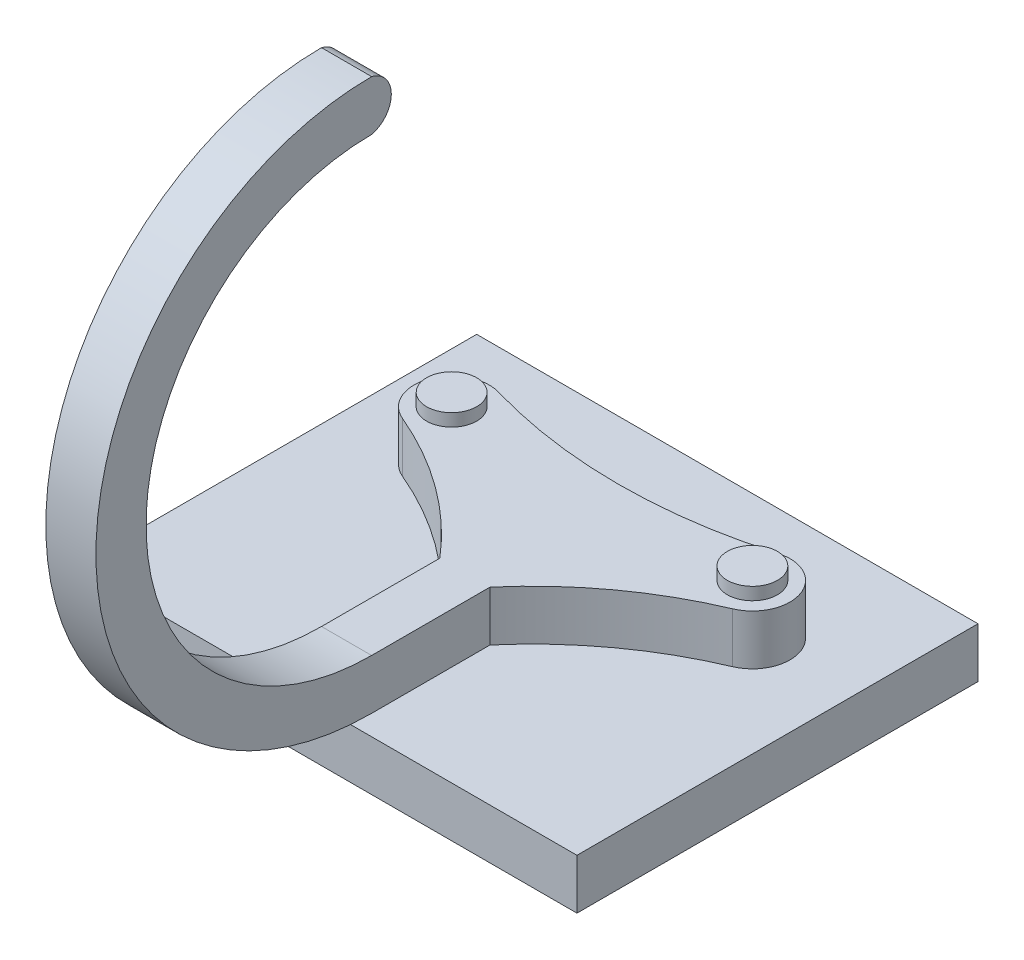
ISO-10303-21;
HEADER;
FILE_DESCRIPTION(('STEP AP214'),'2;1');
FILE_NAME('part.step','',(''),(''),'','','');
FILE_SCHEMA(('AUTOMOTIVE_DESIGN { 1 0 10303 214 1 1 1 1 }'));
ENDSEC;
DATA;
#1=APPLICATION_CONTEXT('core data for automotive mechanical design processes');
#2=APPLICATION_PROTOCOL_DEFINITION('international standard','automotive_design',2000,#1);
#3=PRODUCT_CONTEXT('',#1,'mechanical');
#4=PRODUCT('Part','Part','',(#3));
#5=PRODUCT_RELATED_PRODUCT_CATEGORY('part','',(#4));
#6=PRODUCT_DEFINITION_FORMATION('','',#4);
#7=PRODUCT_DEFINITION_CONTEXT('part definition',#1,'design');
#8=PRODUCT_DEFINITION('design','',#6,#7);
#9=PRODUCT_DEFINITION_SHAPE('','',#8);
#10=(LENGTH_UNIT() NAMED_UNIT(*) SI_UNIT(.MILLI.,.METRE.));
#11=(NAMED_UNIT(*) PLANE_ANGLE_UNIT() SI_UNIT($,.RADIAN.));
#12=(NAMED_UNIT(*) SI_UNIT($,.STERADIAN.) SOLID_ANGLE_UNIT());
#13=UNCERTAINTY_MEASURE_WITH_UNIT(LENGTH_MEASURE(1.E-05),#10,'distance_accuracy_value','');
#14=(GEOMETRIC_REPRESENTATION_CONTEXT(3) GLOBAL_UNCERTAINTY_ASSIGNED_CONTEXT((#13)) GLOBAL_UNIT_ASSIGNED_CONTEXT((#10,
#11,#12)) REPRESENTATION_CONTEXT('',''));
#15=CARTESIAN_POINT('',(0.,0.,0.));
#16=DIRECTION('',(0.,0.,1.));
#17=DIRECTION('',(1.,0.,0.));
#18=AXIS2_PLACEMENT_3D('',#15,#16,#17);
#19=CARTESIAN_POINT('',(10.,2.,-8.));
#20=DIRECTION('',(-1.,0.,0.));
#21=DIRECTION('',(0.,0.,1.));
#22=AXIS2_PLACEMENT_3D('',#19,#20,#21);
#23=PLANE('',#22);
#24=DIRECTION('',(0.,0.,-1.));
#25=VECTOR('',#24,1.);
#26=CARTESIAN_POINT('',(10.,0.,-8.));
#27=LINE('',#26,#25);
#28=CARTESIAN_POINT('',(10.,0.,8.));
#29=VERTEX_POINT('',#28);
#30=CARTESIAN_POINT('',(10.,0.,-8.));
#31=VERTEX_POINT('',#30);
#32=EDGE_CURVE('E254',#29,#31,#27,.T.);
#33=ORIENTED_EDGE('',*,*,#32,.T.);
#34=DIRECTION('',(0.,-1.,0.));
#35=VECTOR('',#34,1.);
#36=CARTESIAN_POINT('',(10.,2.,-8.));
#37=LINE('',#36,#35);
#38=CARTESIAN_POINT('',(10.,2.,-8.));
#39=VERTEX_POINT('',#38);
#40=EDGE_CURVE('E11',#39,#31,#37,.T.);
#41=ORIENTED_EDGE('',*,*,#40,.F.);
#42=DIRECTION('',(0.,0.,-1.));
#43=VECTOR('',#42,1.);
#44=CARTESIAN_POINT('',(10.,2.,-8.));
#45=LINE('',#44,#43);
#46=CARTESIAN_POINT('',(10.,2.,8.));
#47=VERTEX_POINT('',#46);
#48=EDGE_CURVE('E255',#47,#39,#45,.T.);
#49=ORIENTED_EDGE('',*,*,#48,.F.);
#50=DIRECTION('',(0.,-1.,0.));
#51=VECTOR('',#50,1.);
#52=CARTESIAN_POINT('',(10.,2.,8.));
#53=LINE('',#52,#51);
#54=EDGE_CURVE('E269',#47,#29,#53,.T.);
#55=ORIENTED_EDGE('',*,*,#54,.T.);
#56=EDGE_LOOP('',(#33,#41,#49,#55));
#57=FACE_BOUND('',#56,.T.);
#58=ADVANCED_FACE('F39',(#57),#23,.F.);
#59=CARTESIAN_POINT('',(-10.,2.,-8.));
#60=DIRECTION('',(0.,0.,1.));
#61=DIRECTION('',(1.,0.,0.));
#62=AXIS2_PLACEMENT_3D('',#59,#60,#61);
#63=PLANE('',#62);
#64=DIRECTION('',(-1.,0.,0.));
#65=VECTOR('',#64,1.);
#66=CARTESIAN_POINT('',(-10.,0.,-8.));
#67=LINE('',#66,#65);
#68=CARTESIAN_POINT('',(-10.,0.,-8.));
#69=VERTEX_POINT('',#68);
#70=EDGE_CURVE('E273',#31,#69,#67,.T.);
#71=ORIENTED_EDGE('',*,*,#70,.T.);
#72=DIRECTION('',(0.,-1.,0.));
#73=VECTOR('',#72,1.);
#74=CARTESIAN_POINT('',(-10.,2.,-8.));
#75=LINE('',#74,#73);
#76=CARTESIAN_POINT('',(-10.,2.,-8.));
#77=VERTEX_POINT('',#76);
#78=EDGE_CURVE('E47',#77,#69,#75,.T.);
#79=ORIENTED_EDGE('',*,*,#78,.F.);
#80=DIRECTION('',(-1.,0.,0.));
#81=VECTOR('',#80,1.);
#82=CARTESIAN_POINT('',(-10.,2.,-8.));
#83=LINE('',#82,#81);
#84=EDGE_CURVE('E259',#39,#77,#83,.T.);
#85=ORIENTED_EDGE('',*,*,#84,.F.);
#86=ORIENTED_EDGE('',*,*,#40,.T.);
#87=EDGE_LOOP('',(#71,#79,#85,#86));
#88=FACE_BOUND('',#87,.T.);
#89=ADVANCED_FACE('F309',(#88),#63,.F.);
#90=CARTESIAN_POINT('',(-10.,2.,-8.));
#91=DIRECTION('',(1.,0.,0.));
#92=DIRECTION('',(0.,0.,-1.));
#93=AXIS2_PLACEMENT_3D('',#90,#91,#92);
#94=PLANE('',#93);
#95=DIRECTION('',(0.,0.,1.));
#96=VECTOR('',#95,1.);
#97=CARTESIAN_POINT('',(-10.,0.,-8.));
#98=LINE('',#97,#96);
#99=CARTESIAN_POINT('',(-10.,0.,8.));
#100=VERTEX_POINT('',#99);
#101=EDGE_CURVE('E276',#69,#100,#98,.T.);
#102=ORIENTED_EDGE('',*,*,#101,.T.);
#103=DIRECTION('',(0.,-1.,0.));
#104=VECTOR('',#103,1.);
#105=CARTESIAN_POINT('',(-10.,2.,8.));
#106=LINE('',#105,#104);
#107=CARTESIAN_POINT('',(-10.,2.,8.));
#108=VERTEX_POINT('',#107);
#109=EDGE_CURVE('E284',#108,#100,#106,.T.);
#110=ORIENTED_EDGE('',*,*,#109,.F.);
#111=DIRECTION('',(0.,0.,1.));
#112=VECTOR('',#111,1.);
#113=CARTESIAN_POINT('',(-10.,2.,-8.));
#114=LINE('',#113,#112);
#115=EDGE_CURVE('E263',#77,#108,#114,.T.);
#116=ORIENTED_EDGE('',*,*,#115,.F.);
#117=ORIENTED_EDGE('',*,*,#78,.T.);
#118=EDGE_LOOP('',(#102,#110,#116,#117));
#119=FACE_BOUND('',#118,.T.);
#120=ADVANCED_FACE('F293',(#119),#94,.F.);
#121=CARTESIAN_POINT('',(-10.,2.,8.));
#122=DIRECTION('',(0.,0.,-1.));
#123=DIRECTION('',(-1.,0.,0.));
#124=AXIS2_PLACEMENT_3D('',#121,#122,#123);
#125=PLANE('',#124);
#126=DIRECTION('',(1.,0.,0.));
#127=VECTOR('',#126,1.);
#128=CARTESIAN_POINT('',(-10.,0.,8.));
#129=LINE('',#128,#127);
#130=EDGE_CURVE('E260',#100,#29,#129,.T.);
#131=ORIENTED_EDGE('',*,*,#130,.T.);
#132=ORIENTED_EDGE('',*,*,#54,.F.);
#133=DIRECTION('',(1.,0.,0.));
#134=VECTOR('',#133,1.);
#135=CARTESIAN_POINT('',(-10.,2.,8.));
#136=LINE('',#135,#134);
#137=EDGE_CURVE('E266',#108,#47,#136,.T.);
#138=ORIENTED_EDGE('',*,*,#137,.F.);
#139=ORIENTED_EDGE('',*,*,#109,.T.);
#140=EDGE_LOOP('',(#131,#132,#138,#139));
#141=FACE_BOUND('',#140,.T.);
#142=ADVANCED_FACE('F302',(#141),#125,.F.);
#143=CARTESIAN_POINT('',(0.,2.,0.));
#144=DIRECTION('',(0.,1.,0.));
#145=DIRECTION('',(0.,0.,1.));
#146=AXIS2_PLACEMENT_3D('',#143,#144,#145);
#147=PLANE('',#146);
#148=DIRECTION('',(1.,0.,0.));
#149=VECTOR('',#148,1.);
#150=CARTESIAN_POINT('',(-0.999999999999999,2.,7.19088318641341));
#151=LINE('',#150,#149);
#152=CARTESIAN_POINT('',(-1.,2.,7.19088318641342));
#153=VERTEX_POINT('',#152);
#154=CARTESIAN_POINT('',(1.,2.,7.19088318641341));
#155=VERTEX_POINT('',#154);
#156=EDGE_CURVE('E181',#153,#155,#151,.T.);
#157=ORIENTED_EDGE('',*,*,#156,.F.);
#158=DIRECTION('',(0.,0.,1.));
#159=VECTOR('',#158,1.);
#160=CARTESIAN_POINT('',(-0.999999999999999,2.,2.46982330561764));
#161=LINE('',#160,#159);
#162=CARTESIAN_POINT('',(-0.999999999999999,2.,2.46982330561764));
#163=VERTEX_POINT('',#162);
#164=EDGE_CURVE('E54',#163,#153,#161,.T.);
#165=ORIENTED_EDGE('',*,*,#164,.F.);
#166=CARTESIAN_POINT('',(-12.4139361558117,2.,12.2023492588867));
#167=DIRECTION('',(0.,-1.,0.));
#168=DIRECTION('',(0.,0.,-1.));
#169=AXIS2_PLACEMENT_3D('',#166,#167,#168);
#170=CIRCLE('',#169,15.);
#171=CARTESIAN_POINT('',(-6.58308510507381,2.,-1.61796824919213));
#172=VERTEX_POINT('',#171);
#173=EDGE_CURVE('E58',#172,#163,#170,.T.);
#174=ORIENTED_EDGE('',*,*,#173,.F.);
#175=CARTESIAN_POINT('',(-6.,2.,-3.));
#176=DIRECTION('',(0.,1.,0.));
#177=DIRECTION('',(0.,0.,1.));
#178=AXIS2_PLACEMENT_3D('',#175,#176,#177);
#179=CIRCLE('',#178,1.5);
#180=CARTESIAN_POINT('',(-5.58139534883721,2.,-4.44040624339972));
#181=VERTEX_POINT('',#180);
#182=EDGE_CURVE('E224',#181,#172,#179,.T.);
#183=ORIENTED_EDGE('',*,*,#182,.F.);
#184=CARTESIAN_POINT('',(0.,2.,-23.6458228220626));
#185=DIRECTION('',(0.,-1.,0.));
#186=DIRECTION('',(0.,0.,1.));
#187=AXIS2_PLACEMENT_3D('',#184,#185,#186);
#188=CIRCLE('',#187,20.);
#189=CARTESIAN_POINT('',(5.58139534883721,2.,-4.44040624339972));
#190=VERTEX_POINT('',#189);
#191=EDGE_CURVE('E220',#190,#181,#188,.T.);
#192=ORIENTED_EDGE('',*,*,#191,.F.);
#193=CARTESIAN_POINT('',(6.,2.,-3.));
#194=DIRECTION('',(0.,1.,0.));
#195=DIRECTION('',(0.,0.,1.));
#196=AXIS2_PLACEMENT_3D('',#193,#194,#195);
#197=CIRCLE('',#196,1.5);
#198=CARTESIAN_POINT('',(6.58308510507381,2.,-1.61796824919213));
#199=VERTEX_POINT('',#198);
#200=EDGE_CURVE('E216',#199,#190,#197,.T.);
#201=ORIENTED_EDGE('',*,*,#200,.F.);
#202=CARTESIAN_POINT('',(12.4139361558117,2.,12.2023492588867));
#203=DIRECTION('',(0.,-1.,0.));
#204=DIRECTION('',(0.,0.,1.));
#205=AXIS2_PLACEMENT_3D('',#202,#203,#204);
#206=CIRCLE('',#205,15.);
#207=CARTESIAN_POINT('',(1.,2.,2.46982330561764));
#208=VERTEX_POINT('',#207);
#209=EDGE_CURVE('E212',#208,#199,#206,.T.);
#210=ORIENTED_EDGE('',*,*,#209,.F.);
#211=DIRECTION('',(0.,0.,-1.));
#212=VECTOR('',#211,1.);
#213=CARTESIAN_POINT('',(1.,2.,2.46982330561763));
#214=LINE('',#213,#212);
#215=EDGE_CURVE('E209',#155,#208,#214,.T.);
#216=ORIENTED_EDGE('',*,*,#215,.F.);
#217=EDGE_LOOP('',(#157,#165,#174,#183,#192,#201,#210,#216));
#218=FACE_BOUND('',#217,.T.);
#219=ORIENTED_EDGE('',*,*,#48,.T.);
#220=ORIENTED_EDGE('',*,*,#84,.T.);
#221=ORIENTED_EDGE('',*,*,#115,.T.);
#222=ORIENTED_EDGE('',*,*,#137,.T.);
#223=EDGE_LOOP('',(#219,#220,#221,#222));
#224=FACE_BOUND('',#223,.T.);
#225=ADVANCED_FACE('F308',(#218,#224),#147,.T.);
#226=CARTESIAN_POINT('',(0.,0.,0.));
#227=DIRECTION('',(0.,1.,0.));
#228=DIRECTION('',(0.,0.,1.));
#229=AXIS2_PLACEMENT_3D('',#226,#227,#228);
#230=PLANE('',#229);
#231=ORIENTED_EDGE('',*,*,#32,.F.);
#232=ORIENTED_EDGE('',*,*,#130,.F.);
#233=ORIENTED_EDGE('',*,*,#101,.F.);
#234=ORIENTED_EDGE('',*,*,#70,.F.);
#235=EDGE_LOOP('',(#231,#232,#233,#234));
#236=FACE_BOUND('',#235,.T.);
#237=ADVANCED_FACE('F299',(#236),#230,.F.);
#238=CARTESIAN_POINT('',(12.4139361558117,4.,12.2023492588867));
#239=DIRECTION('',(0.,1.,0.));
#240=DIRECTION('',(0.,0.,1.));
#241=AXIS2_PLACEMENT_3D('',#238,#239,#240);
#242=PLANE('',#241);
#243=CARTESIAN_POINT('',(-6.,4.,-3.));
#244=DIRECTION('',(0.,1.,0.));
#245=DIRECTION('',(0.,0.,1.));
#246=AXIS2_PLACEMENT_3D('',#243,#244,#245);
#247=CIRCLE('',#246,1.);
#248=CARTESIAN_POINT('',(-6.,4.,-2.));
#249=VERTEX_POINT('',#248);
#250=EDGE_CURVE('E173',#249,#249,#247,.T.);
#251=ORIENTED_EDGE('',*,*,#250,.F.);
#252=EDGE_LOOP('',(#251));
#253=FACE_BOUND('',#252,.T.);
#254=DIRECTION('',(1.,0.,0.));
#255=VECTOR('',#254,1.);
#256=CARTESIAN_POINT('',(-0.999999999999999,4.,7.19088318641341));
#257=LINE('',#256,#255);
#258=CARTESIAN_POINT('',(-0.999999999999999,4.,7.19088318641341));
#259=VERTEX_POINT('',#258);
#260=CARTESIAN_POINT('',(1.,4.,7.19088318641341));
#261=VERTEX_POINT('',#260);
#262=EDGE_CURVE('E182',#259,#261,#257,.T.);
#263=ORIENTED_EDGE('',*,*,#262,.T.);
#264=DIRECTION('',(0.,0.,-1.));
#265=VECTOR('',#264,1.);
#266=CARTESIAN_POINT('',(1.,4.,2.46982330561763));
#267=LINE('',#266,#265);
#268=CARTESIAN_POINT('',(1.,4.,2.46982330561764));
#269=VERTEX_POINT('',#268);
#270=EDGE_CURVE('E157',#261,#269,#267,.T.);
#271=ORIENTED_EDGE('',*,*,#270,.T.);
#272=CARTESIAN_POINT('',(12.4139361558117,4.,12.2023492588867));
#273=DIRECTION('',(0.,-1.,0.));
#274=DIRECTION('',(0.,0.,1.));
#275=AXIS2_PLACEMENT_3D('',#272,#273,#274);
#276=CIRCLE('',#275,15.);
#277=CARTESIAN_POINT('',(6.58308510507381,4.,-1.61796824919213));
#278=VERTEX_POINT('',#277);
#279=EDGE_CURVE('E187',#269,#278,#276,.T.);
#280=ORIENTED_EDGE('',*,*,#279,.T.);
#281=CARTESIAN_POINT('',(6.,4.,-3.));
#282=DIRECTION('',(0.,1.,0.));
#283=DIRECTION('',(0.,0.,1.));
#284=AXIS2_PLACEMENT_3D('',#281,#282,#283);
#285=CIRCLE('',#284,1.5);
#286=CARTESIAN_POINT('',(5.58139534883721,4.,-4.44040624339972));
#287=VERTEX_POINT('',#286);
#288=EDGE_CURVE('E190',#278,#287,#285,.T.);
#289=ORIENTED_EDGE('',*,*,#288,.T.);
#290=CARTESIAN_POINT('',(0.,4.,-23.6458228220626));
#291=DIRECTION('',(0.,-1.,0.));
#292=DIRECTION('',(0.,0.,1.));
#293=AXIS2_PLACEMENT_3D('',#290,#291,#292);
#294=CIRCLE('',#293,20.);
#295=CARTESIAN_POINT('',(-5.58139534883721,4.,-4.44040624339972));
#296=VERTEX_POINT('',#295);
#297=EDGE_CURVE('E193',#287,#296,#294,.T.);
#298=ORIENTED_EDGE('',*,*,#297,.T.);
#299=CARTESIAN_POINT('',(-6.,4.,-3.));
#300=DIRECTION('',(0.,1.,0.));
#301=DIRECTION('',(0.,0.,1.));
#302=AXIS2_PLACEMENT_3D('',#299,#300,#301);
#303=CIRCLE('',#302,1.5);
#304=CARTESIAN_POINT('',(-6.58308510507381,4.,-1.61796824919213));
#305=VERTEX_POINT('',#304);
#306=EDGE_CURVE('E196',#296,#305,#303,.T.);
#307=ORIENTED_EDGE('',*,*,#306,.T.);
#308=CARTESIAN_POINT('',(-12.4139361558117,4.,12.2023492588867));
#309=DIRECTION('',(0.,-1.,0.));
#310=DIRECTION('',(0.,0.,-1.));
#311=AXIS2_PLACEMENT_3D('',#308,#309,#310);
#312=CIRCLE('',#311,15.);
#313=CARTESIAN_POINT('',(-0.999999999999999,4.,2.46982330561764));
#314=VERTEX_POINT('',#313);
#315=EDGE_CURVE('E199',#305,#314,#312,.T.);
#316=ORIENTED_EDGE('',*,*,#315,.T.);
#317=DIRECTION('',(0.,0.,1.));
#318=VECTOR('',#317,1.);
#319=CARTESIAN_POINT('',(-0.999999999999999,4.,2.46982330561764));
#320=LINE('',#319,#318);
#321=EDGE_CURVE('E202',#314,#259,#320,.T.);
#322=ORIENTED_EDGE('',*,*,#321,.T.);
#323=EDGE_LOOP('',(#263,#271,#280,#289,#298,#307,#316,#322));
#324=FACE_BOUND('',#323,.T.);
#325=CARTESIAN_POINT('',(6.,4.,-3.));
#326=DIRECTION('',(0.,1.,0.));
#327=DIRECTION('',(0.,0.,1.));
#328=AXIS2_PLACEMENT_3D('',#325,#326,#327);
#329=CIRCLE('',#328,1.);
#330=CARTESIAN_POINT('',(6.,4.,-2.));
#331=VERTEX_POINT('',#330);
#332=EDGE_CURVE('E168',#331,#331,#329,.T.);
#333=ORIENTED_EDGE('',*,*,#332,.F.);
#334=EDGE_LOOP('',(#333));
#335=FACE_BOUND('',#334,.T.);
#336=ADVANCED_FACE('F321',(#253,#324,#335),#242,.T.);
#337=CARTESIAN_POINT('',(1.,4.,2.46982330561763));
#338=DIRECTION('',(-1.,0.,0.));
#339=DIRECTION('',(0.,0.,1.));
#340=AXIS2_PLACEMENT_3D('',#337,#338,#339);
#341=PLANE('',#340);
#342=ORIENTED_EDGE('',*,*,#215,.T.);
#343=DIRECTION('',(0.,-1.,0.));
#344=VECTOR('',#343,1.);
#345=CARTESIAN_POINT('',(1.,4.,2.46982330561764));
#346=LINE('',#345,#344);
#347=EDGE_CURVE('E250',#269,#208,#346,.T.);
#348=ORIENTED_EDGE('',*,*,#347,.F.);
#349=ORIENTED_EDGE('',*,*,#270,.F.);
#350=CARTESIAN_POINT('',(1.,13.,7.1908831864134));
#351=DIRECTION('',(-1.,0.,0.));
#352=DIRECTION('',(0.,0.,1.));
#353=AXIS2_PLACEMENT_3D('',#350,#351,#352);
#354=CIRCLE('',#353,9.);
#355=CARTESIAN_POINT('',(1.,22.,7.19088318641341));
#356=VERTEX_POINT('',#355);
#357=EDGE_CURVE('E151',#261,#356,#354,.T.);
#358=ORIENTED_EDGE('',*,*,#357,.T.);
#359=CARTESIAN_POINT('',(1.,23.,7.43544881900916));
#360=DIRECTION('',(1.,0.,0.));
#361=DIRECTION('',(0.,0.,1.));
#362=AXIS2_PLACEMENT_3D('',#359,#360,#361);
#363=CIRCLE('',#362,1.02947187851197);
#364=CARTESIAN_POINT('',(1.,24.,7.19088318641341));
#365=VERTEX_POINT('',#364);
#366=EDGE_CURVE('E138',#356,#365,#363,.T.);
#367=ORIENTED_EDGE('',*,*,#366,.T.);
#368=CARTESIAN_POINT('',(1.,13.,7.1908831864134));
#369=DIRECTION('',(1.,0.,0.));
#370=DIRECTION('',(0.,0.,1.));
#371=AXIS2_PLACEMENT_3D('',#368,#369,#370);
#372=CIRCLE('',#371,11.);
#373=EDGE_CURVE('E150',#365,#155,#372,.T.);
#374=ORIENTED_EDGE('',*,*,#373,.T.);
#375=EDGE_LOOP('',(#342,#348,#349,#358,#367,#374));
#376=FACE_BOUND('',#375,.T.);
#377=ADVANCED_FACE('F155',(#376),#341,.F.);
#378=CARTESIAN_POINT('',(12.4139361558117,4.,12.2023492588867));
#379=DIRECTION('',(0.,-1.,0.));
#380=DIRECTION('',(0.,0.,-1.));
#381=AXIS2_PLACEMENT_3D('',#378,#379,#380);
#382=CYLINDRICAL_SURFACE('',#381,15.);
#383=ORIENTED_EDGE('',*,*,#209,.T.);
#384=DIRECTION('',(0.,-1.,0.));
#385=VECTOR('',#384,1.);
#386=CARTESIAN_POINT('',(6.58308510507381,4.,-1.61796824919213));
#387=LINE('',#386,#385);
#388=EDGE_CURVE('E246',#278,#199,#387,.T.);
#389=ORIENTED_EDGE('',*,*,#388,.F.);
#390=ORIENTED_EDGE('',*,*,#279,.F.);
#391=ORIENTED_EDGE('',*,*,#347,.T.);
#392=EDGE_LOOP('',(#383,#389,#390,#391));
#393=FACE_BOUND('',#392,.T.);
#394=ADVANCED_FACE('F326',(#393),#382,.F.);
#395=CARTESIAN_POINT('',(6.,4.,-3.));
#396=DIRECTION('',(0.,-1.,0.));
#397=DIRECTION('',(0.,0.,-1.));
#398=AXIS2_PLACEMENT_3D('',#395,#396,#397);
#399=CYLINDRICAL_SURFACE('',#398,1.5);
#400=ORIENTED_EDGE('',*,*,#200,.T.);
#401=DIRECTION('',(0.,-1.,0.));
#402=VECTOR('',#401,1.);
#403=CARTESIAN_POINT('',(5.58139534883721,4.,-4.44040624339972));
#404=LINE('',#403,#402);
#405=EDGE_CURVE('E242',#287,#190,#404,.T.);
#406=ORIENTED_EDGE('',*,*,#405,.F.);
#407=ORIENTED_EDGE('',*,*,#288,.F.);
#408=ORIENTED_EDGE('',*,*,#388,.T.);
#409=EDGE_LOOP('',(#400,#406,#407,#408));
#410=FACE_BOUND('',#409,.T.);
#411=ADVANCED_FACE('F329',(#410),#399,.T.);
#412=CARTESIAN_POINT('',(0.,4.,-23.6458228220626));
#413=DIRECTION('',(0.,-1.,0.));
#414=DIRECTION('',(0.,0.,-1.));
#415=AXIS2_PLACEMENT_3D('',#412,#413,#414);
#416=CYLINDRICAL_SURFACE('',#415,20.);
#417=ORIENTED_EDGE('',*,*,#191,.T.);
#418=DIRECTION('',(0.,-1.,0.));
#419=VECTOR('',#418,1.);
#420=CARTESIAN_POINT('',(-5.58139534883721,4.,-4.44040624339972));
#421=LINE('',#420,#419);
#422=EDGE_CURVE('E238',#296,#181,#421,.T.);
#423=ORIENTED_EDGE('',*,*,#422,.F.);
#424=ORIENTED_EDGE('',*,*,#297,.F.);
#425=ORIENTED_EDGE('',*,*,#405,.T.);
#426=EDGE_LOOP('',(#417,#423,#424,#425));
#427=FACE_BOUND('',#426,.T.);
#428=ADVANCED_FACE('F333',(#427),#416,.F.);
#429=CARTESIAN_POINT('',(-6.,4.,-3.));
#430=DIRECTION('',(0.,-1.,0.));
#431=DIRECTION('',(0.,0.,-1.));
#432=AXIS2_PLACEMENT_3D('',#429,#430,#431);
#433=CYLINDRICAL_SURFACE('',#432,1.5);
#434=ORIENTED_EDGE('',*,*,#182,.T.);
#435=DIRECTION('',(0.,-1.,0.));
#436=VECTOR('',#435,1.);
#437=CARTESIAN_POINT('',(-6.58308510507381,4.,-1.61796824919213));
#438=LINE('',#437,#436);
#439=EDGE_CURVE('E234',#305,#172,#438,.T.);
#440=ORIENTED_EDGE('',*,*,#439,.F.);
#441=ORIENTED_EDGE('',*,*,#306,.F.);
#442=ORIENTED_EDGE('',*,*,#422,.T.);
#443=EDGE_LOOP('',(#434,#440,#441,#442));
#444=FACE_BOUND('',#443,.T.);
#445=ADVANCED_FACE('F337',(#444),#433,.T.);
#446=CARTESIAN_POINT('',(-12.4139361558117,4.,12.2023492588867));
#447=DIRECTION('',(0.,-1.,0.));
#448=DIRECTION('',(0.,0.,-1.));
#449=AXIS2_PLACEMENT_3D('',#446,#447,#448);
#450=CYLINDRICAL_SURFACE('',#449,15.);
#451=ORIENTED_EDGE('',*,*,#173,.T.);
#452=DIRECTION('',(0.,-1.,0.));
#453=VECTOR('',#452,1.);
#454=CARTESIAN_POINT('',(-0.999999999999999,4.,2.46982330561764));
#455=LINE('',#454,#453);
#456=EDGE_CURVE('E205',#314,#163,#455,.T.);
#457=ORIENTED_EDGE('',*,*,#456,.F.);
#458=ORIENTED_EDGE('',*,*,#315,.F.);
#459=ORIENTED_EDGE('',*,*,#439,.T.);
#460=EDGE_LOOP('',(#451,#457,#458,#459));
#461=FACE_BOUND('',#460,.T.);
#462=ADVANCED_FACE('F341',(#461),#450,.F.);
#463=CARTESIAN_POINT('',(-0.999999999999999,4.,2.46982330561764));
#464=DIRECTION('',(1.,0.,0.));
#465=DIRECTION('',(0.,0.,-1.));
#466=AXIS2_PLACEMENT_3D('',#463,#464,#465);
#467=PLANE('',#466);
#468=ORIENTED_EDGE('',*,*,#164,.T.);
#469=CARTESIAN_POINT('',(-1.,13.,7.1908831864134));
#470=DIRECTION('',(1.,0.,0.));
#471=DIRECTION('',(0.,0.,1.));
#472=AXIS2_PLACEMENT_3D('',#469,#470,#471);
#473=CIRCLE('',#472,11.);
#474=CARTESIAN_POINT('',(-1.,24.,7.19088318641341));
#475=VERTEX_POINT('',#474);
#476=EDGE_CURVE('E162',#475,#153,#473,.T.);
#477=ORIENTED_EDGE('',*,*,#476,.F.);
#478=CARTESIAN_POINT('',(-1.,23.,7.43544881900916));
#479=DIRECTION('',(1.,0.,0.));
#480=DIRECTION('',(0.,0.,1.));
#481=AXIS2_PLACEMENT_3D('',#478,#479,#480);
#482=CIRCLE('',#481,1.02947187851197);
#483=CARTESIAN_POINT('',(-1.,22.,7.19088318641341));
#484=VERTEX_POINT('',#483);
#485=EDGE_CURVE('E393',#484,#475,#482,.T.);
#486=ORIENTED_EDGE('',*,*,#485,.F.);
#487=CARTESIAN_POINT('',(-1.,13.,7.1908831864134));
#488=DIRECTION('',(-1.,0.,0.));
#489=DIRECTION('',(0.,0.,1.));
#490=AXIS2_PLACEMENT_3D('',#487,#488,#489);
#491=CIRCLE('',#490,9.);
#492=EDGE_CURVE('E166',#259,#484,#491,.T.);
#493=ORIENTED_EDGE('',*,*,#492,.F.);
#494=ORIENTED_EDGE('',*,*,#321,.F.);
#495=ORIENTED_EDGE('',*,*,#456,.T.);
#496=EDGE_LOOP('',(#468,#477,#486,#493,#494,#495));
#497=FACE_BOUND('',#496,.T.);
#498=ADVANCED_FACE('F345',(#497),#467,.F.);
#499=CARTESIAN_POINT('',(1.,13.,7.1908831864134));
#500=DIRECTION('',(-1.,0.,0.));
#501=DIRECTION('',(0.,0.,1.));
#502=AXIS2_PLACEMENT_3D('',#499,#500,#501);
#503=CYLINDRICAL_SURFACE('',#502,9.);
#504=ORIENTED_EDGE('',*,*,#492,.T.);
#505=DIRECTION('',(-1.,0.,0.));
#506=VECTOR('',#505,1.);
#507=CARTESIAN_POINT('',(1.,22.,7.19088318641341));
#508=LINE('',#507,#506);
#509=EDGE_CURVE('E142',#356,#484,#508,.T.);
#510=ORIENTED_EDGE('',*,*,#509,.F.);
#511=ORIENTED_EDGE('',*,*,#357,.F.);
#512=ORIENTED_EDGE('',*,*,#262,.F.);
#513=EDGE_LOOP('',(#504,#510,#511,#512));
#514=FACE_BOUND('',#513,.T.);
#515=ADVANCED_FACE('F164',(#514),#503,.F.);
#516=CARTESIAN_POINT('',(1.,23.,7.43544881900916));
#517=DIRECTION('',(-1.,0.,0.));
#518=DIRECTION('',(0.,0.,1.));
#519=AXIS2_PLACEMENT_3D('',#516,#517,#518);
#520=CYLINDRICAL_SURFACE('',#519,1.02947187851197);
#521=ORIENTED_EDGE('',*,*,#485,.T.);
#522=DIRECTION('',(-1.,0.,0.));
#523=VECTOR('',#522,1.);
#524=CARTESIAN_POINT('',(1.,24.,7.19088318641341));
#525=LINE('',#524,#523);
#526=EDGE_CURVE('E145',#365,#475,#525,.T.);
#527=ORIENTED_EDGE('',*,*,#526,.F.);
#528=ORIENTED_EDGE('',*,*,#366,.F.);
#529=ORIENTED_EDGE('',*,*,#509,.T.);
#530=EDGE_LOOP('',(#521,#527,#528,#529));
#531=FACE_BOUND('',#530,.T.);
#532=ADVANCED_FACE('F140',(#531),#520,.T.);
#533=CARTESIAN_POINT('',(1.,13.,7.1908831864134));
#534=DIRECTION('',(-1.,0.,0.));
#535=DIRECTION('',(0.,0.,1.));
#536=AXIS2_PLACEMENT_3D('',#533,#534,#535);
#537=CYLINDRICAL_SURFACE('',#536,11.);
#538=ORIENTED_EDGE('',*,*,#476,.T.);
#539=ORIENTED_EDGE('',*,*,#156,.T.);
#540=ORIENTED_EDGE('',*,*,#373,.F.);
#541=ORIENTED_EDGE('',*,*,#526,.T.);
#542=EDGE_LOOP('',(#538,#539,#540,#541));
#543=FACE_BOUND('',#542,.T.);
#544=ADVANCED_FACE('F357',(#543),#537,.T.);
#545=CARTESIAN_POINT('',(6.,4.5,-3.));
#546=DIRECTION('',(0.,-1.,0.));
#547=DIRECTION('',(0.,0.,-1.));
#548=AXIS2_PLACEMENT_3D('',#545,#546,#547);
#549=CYLINDRICAL_SURFACE('',#548,1.);
#550=ORIENTED_EDGE('',*,*,#332,.T.);
#551=EDGE_LOOP('',(#550));
#552=FACE_BOUND('',#551,.T.);
#553=CARTESIAN_POINT('',(6.,4.5,-3.));
#554=DIRECTION('',(0.,1.,0.));
#555=DIRECTION('',(0.,0.,1.));
#556=AXIS2_PLACEMENT_3D('',#553,#554,#555);
#557=CIRCLE('',#556,1.);
#558=CARTESIAN_POINT('',(6.,4.5,-2.));
#559=VERTEX_POINT('',#558);
#560=EDGE_CURVE('E383',#559,#559,#557,.T.);
#561=ORIENTED_EDGE('',*,*,#560,.F.);
#562=EDGE_LOOP('',(#561));
#563=FACE_BOUND('',#562,.T.);
#564=ADVANCED_FACE('F360',(#552,#563),#549,.T.);
#565=CARTESIAN_POINT('',(6.,4.5,-3.));
#566=DIRECTION('',(0.,1.,0.));
#567=DIRECTION('',(0.,0.,1.));
#568=AXIS2_PLACEMENT_3D('',#565,#566,#567);
#569=PLANE('',#568);
#570=ORIENTED_EDGE('',*,*,#560,.T.);
#571=EDGE_LOOP('',(#570));
#572=FACE_BOUND('',#571,.T.);
#573=ADVANCED_FACE('F364',(#572),#569,.T.);
#574=CARTESIAN_POINT('',(-6.,4.5,-3.));
#575=DIRECTION('',(0.,-1.,0.));
#576=DIRECTION('',(0.,0.,-1.));
#577=AXIS2_PLACEMENT_3D('',#574,#575,#576);
#578=CYLINDRICAL_SURFACE('',#577,1.);
#579=ORIENTED_EDGE('',*,*,#250,.T.);
#580=EDGE_LOOP('',(#579));
#581=FACE_BOUND('',#580,.T.);
#582=CARTESIAN_POINT('',(-6.,4.5,-3.));
#583=DIRECTION('',(0.,1.,0.));
#584=DIRECTION('',(0.,0.,1.));
#585=AXIS2_PLACEMENT_3D('',#582,#583,#584);
#586=CIRCLE('',#585,1.);
#587=CARTESIAN_POINT('',(-6.,4.5,-2.));
#588=VERTEX_POINT('',#587);
#589=EDGE_CURVE('E380',#588,#588,#586,.T.);
#590=ORIENTED_EDGE('',*,*,#589,.F.);
#591=EDGE_LOOP('',(#590));
#592=FACE_BOUND('',#591,.T.);
#593=ADVANCED_FACE('F368',(#581,#592),#578,.T.);
#594=CARTESIAN_POINT('',(-6.,4.5,-3.));
#595=DIRECTION('',(0.,1.,0.));
#596=DIRECTION('',(0.,0.,1.));
#597=AXIS2_PLACEMENT_3D('',#594,#595,#596);
#598=PLANE('',#597);
#599=ORIENTED_EDGE('',*,*,#589,.T.);
#600=EDGE_LOOP('',(#599));
#601=FACE_BOUND('',#600,.T.);
#602=ADVANCED_FACE('F372',(#601),#598,.T.);
#603=CLOSED_SHELL('',(#58,#89,#120,#142,#225,#237,#336,#377,#394,#411,#428,#445,#462,#498,#515,
#532,#544,#564,#573,#593,#602));
#604=MANIFOLD_SOLID_BREP('B2',#603);
#605=ADVANCED_BREP_SHAPE_REPRESENTATION('',(#18,#604),#14);
#606=SHAPE_DEFINITION_REPRESENTATION(#9,#605);
ENDSEC;
END-ISO-10303-21;
